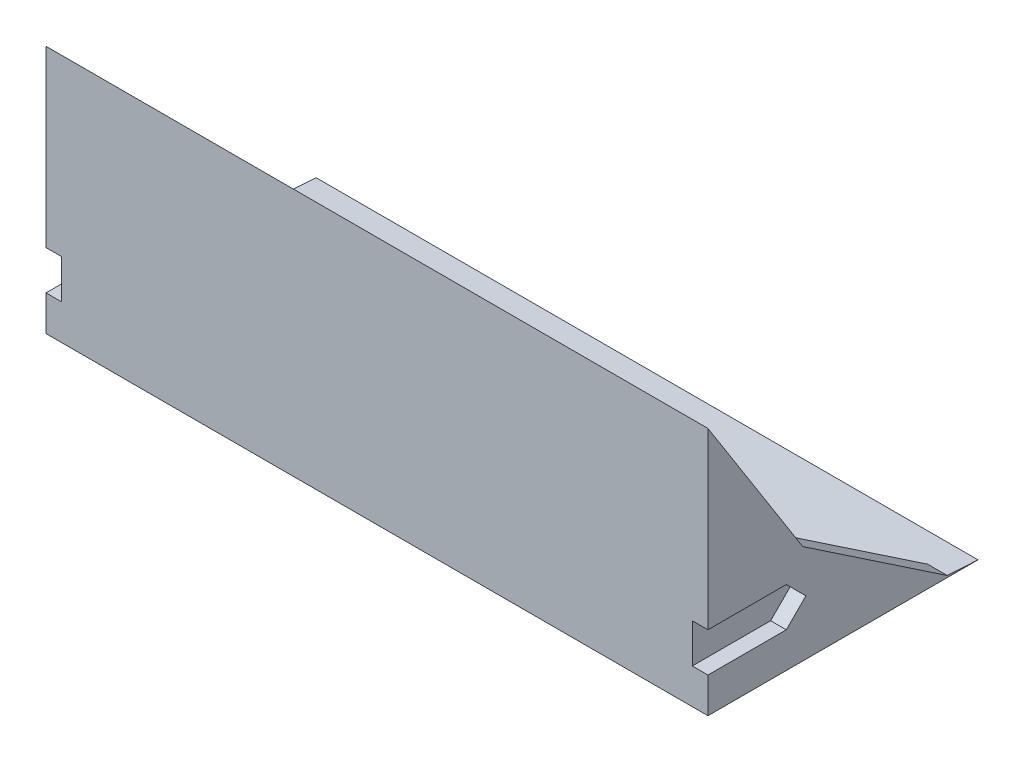
ISO-10303-21;
HEADER;
FILE_DESCRIPTION(('STEP AP214'),'2;1');
FILE_NAME('part.step','',(''),(''),'','','');
FILE_SCHEMA(('AUTOMOTIVE_DESIGN { 1 0 10303 214 1 1 1 1 }'));
ENDSEC;
DATA;
#1=APPLICATION_CONTEXT('core data for automotive mechanical design processes');
#2=APPLICATION_PROTOCOL_DEFINITION('international standard','automotive_design',2000,#1);
#3=PRODUCT_CONTEXT('',#1,'mechanical');
#4=PRODUCT('Part','Part','',(#3));
#5=PRODUCT_RELATED_PRODUCT_CATEGORY('part','',(#4));
#6=PRODUCT_DEFINITION_FORMATION('','',#4);
#7=PRODUCT_DEFINITION_CONTEXT('part definition',#1,'design');
#8=PRODUCT_DEFINITION('design','',#6,#7);
#9=PRODUCT_DEFINITION_SHAPE('','',#8);
#10=(LENGTH_UNIT() NAMED_UNIT(*) SI_UNIT(.MILLI.,.METRE.));
#11=(NAMED_UNIT(*) PLANE_ANGLE_UNIT() SI_UNIT($,.RADIAN.));
#12=(NAMED_UNIT(*) SI_UNIT($,.STERADIAN.) SOLID_ANGLE_UNIT());
#13=UNCERTAINTY_MEASURE_WITH_UNIT(LENGTH_MEASURE(1.E-05),#10,'distance_accuracy_value','');
#14=(GEOMETRIC_REPRESENTATION_CONTEXT(3) GLOBAL_UNCERTAINTY_ASSIGNED_CONTEXT((#13)) GLOBAL_UNIT_ASSIGNED_CONTEXT((#10,
#11,#12)) REPRESENTATION_CONTEXT('',''));
#15=CARTESIAN_POINT('',(0.,0.,0.));
#16=DIRECTION('',(0.,0.,1.));
#17=DIRECTION('',(1.,0.,0.));
#18=AXIS2_PLACEMENT_3D('',#15,#16,#17);
#19=CARTESIAN_POINT('',(84.455,63.5,0.));
#20=DIRECTION('',(0.,0.,-1.));
#21=DIRECTION('',(-1.,0.,0.));
#22=AXIS2_PLACEMENT_3D('',#19,#20,#21);
#23=PLANE('',#22);
#24=DIRECTION('',(-1.,0.,0.));
#25=VECTOR('',#24,1.);
#26=CARTESIAN_POINT('',(-80.455,8.99999999999999,0.));
#27=LINE('',#26,#25);
#28=CARTESIAN_POINT('',(-80.455,8.99999999999999,0.));
#29=VERTEX_POINT('',#28);
#30=CARTESIAN_POINT('',(-84.455,8.99999999999999,0.));
#31=VERTEX_POINT('',#30);
#32=EDGE_CURVE('E252',#29,#31,#27,.T.);
#33=ORIENTED_EDGE('',*,*,#32,.T.);
#34=DIRECTION('',(0.,-1.,0.));
#35=VECTOR('',#34,1.);
#36=CARTESIAN_POINT('',(-84.455,63.5,0.));
#37=LINE('',#36,#35);
#38=CARTESIAN_POINT('',(-84.455,0.,0.));
#39=VERTEX_POINT('',#38);
#40=EDGE_CURVE('E338',#31,#39,#37,.T.);
#41=ORIENTED_EDGE('',*,*,#40,.T.);
#42=DIRECTION('',(-1.,0.,0.));
#43=VECTOR('',#42,1.);
#44=CARTESIAN_POINT('',(84.455,0.,0.));
#45=LINE('',#44,#43);
#46=CARTESIAN_POINT('',(84.455,0.,0.));
#47=VERTEX_POINT('',#46);
#48=EDGE_CURVE('E363',#47,#39,#45,.T.);
#49=ORIENTED_EDGE('',*,*,#48,.F.);
#50=DIRECTION('',(0.,-1.,0.));
#51=VECTOR('',#50,1.);
#52=CARTESIAN_POINT('',(84.455,63.5,0.));
#53=LINE('',#52,#51);
#54=CARTESIAN_POINT('',(84.455,8.99999999999999,0.));
#55=VERTEX_POINT('',#54);
#56=EDGE_CURVE('E344',#55,#47,#53,.T.);
#57=ORIENTED_EDGE('',*,*,#56,.F.);
#58=DIRECTION('',(1.,0.,0.));
#59=VECTOR('',#58,1.);
#60=CARTESIAN_POINT('',(80.455,8.99999999999999,0.));
#61=LINE('',#60,#59);
#62=CARTESIAN_POINT('',(80.455,8.99999999999999,0.));
#63=VERTEX_POINT('',#62);
#64=EDGE_CURVE('E287',#63,#55,#61,.T.);
#65=ORIENTED_EDGE('',*,*,#64,.F.);
#66=DIRECTION('',(0.,-1.,0.));
#67=VECTOR('',#66,1.);
#68=CARTESIAN_POINT('',(80.455,8.99999999999999,0.));
#69=LINE('',#68,#67);
#70=CARTESIAN_POINT('',(80.455,19.,0.));
#71=VERTEX_POINT('',#70);
#72=EDGE_CURVE('E266',#71,#63,#69,.T.);
#73=ORIENTED_EDGE('',*,*,#72,.F.);
#74=DIRECTION('',(1.,0.,0.));
#75=VECTOR('',#74,1.);
#76=CARTESIAN_POINT('',(80.455,19.,0.));
#77=LINE('',#76,#75);
#78=CARTESIAN_POINT('',(84.455,19.,0.));
#79=VERTEX_POINT('',#78);
#80=EDGE_CURVE('E301',#71,#79,#77,.T.);
#81=ORIENTED_EDGE('',*,*,#80,.T.);
#82=CARTESIAN_POINT('',(84.455,63.5,0.));
#83=VERTEX_POINT('',#82);
#84=EDGE_CURVE('E339',#83,#79,#53,.T.);
#85=ORIENTED_EDGE('',*,*,#84,.F.);
#86=DIRECTION('',(-1.,0.,0.));
#87=VECTOR('',#86,1.);
#88=CARTESIAN_POINT('',(84.455,63.5,0.));
#89=LINE('',#88,#87);
#90=CARTESIAN_POINT('',(64.455,63.5,0.));
#91=VERTEX_POINT('',#90);
#92=EDGE_CURVE('E368',#83,#91,#89,.T.);
#93=ORIENTED_EDGE('',*,*,#92,.T.);
#94=CARTESIAN_POINT('',(-64.455,63.5,0.));
#95=VERTEX_POINT('',#94);
#96=EDGE_CURVE('E367',#91,#95,#89,.T.);
#97=ORIENTED_EDGE('',*,*,#96,.T.);
#98=DIRECTION('',(-1.,0.,0.));
#99=VECTOR('',#98,1.);
#100=CARTESIAN_POINT('',(-79.455,63.5,0.));
#101=LINE('',#100,#99);
#102=CARTESIAN_POINT('',(-84.455,63.5,0.));
#103=VERTEX_POINT('',#102);
#104=EDGE_CURVE('E247',#95,#103,#101,.T.);
#105=ORIENTED_EDGE('',*,*,#104,.T.);
#106=CARTESIAN_POINT('',(-84.455,19.,0.));
#107=VERTEX_POINT('',#106);
#108=EDGE_CURVE('E228',#103,#107,#37,.T.);
#109=ORIENTED_EDGE('',*,*,#108,.T.);
#110=DIRECTION('',(-1.,0.,0.));
#111=VECTOR('',#110,1.);
#112=CARTESIAN_POINT('',(-80.455,19.,0.));
#113=LINE('',#112,#111);
#114=CARTESIAN_POINT('',(-80.455,19.,0.));
#115=VERTEX_POINT('',#114);
#116=EDGE_CURVE('E207',#115,#107,#113,.T.);
#117=ORIENTED_EDGE('',*,*,#116,.F.);
#118=DIRECTION('',(0.,-1.,0.));
#119=VECTOR('',#118,1.);
#120=CARTESIAN_POINT('',(-80.455,8.99999999999999,0.));
#121=LINE('',#120,#119);
#122=EDGE_CURVE('E214',#115,#29,#121,.T.);
#123=ORIENTED_EDGE('',*,*,#122,.T.);
#124=EDGE_LOOP('',(#33,#41,#49,#57,#65,#73,#81,#85,#93,#97,#105,#109,#117,#123));
#125=FACE_BOUND('',#124,.T.);
#126=ADVANCED_FACE('F50',(#125),#23,.F.);
#127=CARTESIAN_POINT('',(-84.455,0.,0.));
#128=DIRECTION('',(-1.,0.,0.));
#129=DIRECTION('',(0.,0.,1.));
#130=AXIS2_PLACEMENT_3D('',#127,#128,#129);
#131=PLANE('',#130);
#132=ORIENTED_EDGE('',*,*,#40,.F.);
#133=DIRECTION('',(0.,0.,-1.));
#134=VECTOR('',#133,1.);
#135=CARTESIAN_POINT('',(-84.455,8.99999999999999,-20.));
#136=LINE('',#135,#134);
#137=CARTESIAN_POINT('',(-84.455,8.99999999999999,-20.));
#138=VERTEX_POINT('',#137);
#139=EDGE_CURVE('E224',#31,#138,#136,.T.);
#140=ORIENTED_EDGE('',*,*,#139,.T.);
#141=DIRECTION('',(0.,0.707106781186548,-0.707106781186548));
#142=VECTOR('',#141,1.);
#143=CARTESIAN_POINT('',(-84.455,14.,-25.));
#144=LINE('',#143,#142);
#145=CARTESIAN_POINT('',(-84.455,14.,-25.));
#146=VERTEX_POINT('',#145);
#147=EDGE_CURVE('E810',#138,#146,#144,.T.);
#148=ORIENTED_EDGE('',*,*,#147,.T.);
#149=DIRECTION('',(0.,0.707106781186548,0.707106781186548));
#150=VECTOR('',#149,1.);
#151=CARTESIAN_POINT('',(-84.455,19.,-20.));
#152=LINE('',#151,#150);
#153=CARTESIAN_POINT('',(-84.455,19.,-20.));
#154=VERTEX_POINT('',#153);
#155=EDGE_CURVE('E814',#146,#154,#152,.T.);
#156=ORIENTED_EDGE('',*,*,#155,.T.);
#157=DIRECTION('',(0.,0.,1.));
#158=VECTOR('',#157,1.);
#159=CARTESIAN_POINT('',(-84.455,19.,0.));
#160=LINE('',#159,#158);
#161=EDGE_CURVE('E818',#154,#107,#160,.T.);
#162=ORIENTED_EDGE('',*,*,#161,.T.);
#163=ORIENTED_EDGE('',*,*,#108,.F.);
#164=DIRECTION('',(0.,0.844765875126408,0.535136072622575));
#165=VECTOR('',#164,1.);
#166=CARTESIAN_POINT('',(-84.455,63.5,0.));
#167=LINE('',#166,#165);
#168=CARTESIAN_POINT('',(-84.455,25.2665789898625,-24.219826303032));
#169=VERTEX_POINT('',#168);
#170=EDGE_CURVE('E248',#169,#103,#167,.T.);
#171=ORIENTED_EDGE('',*,*,#170,.F.);
#172=DIRECTION('',(0.,0.558264030471201,0.829663348763853));
#173=VECTOR('',#172,1.);
#174=CARTESIAN_POINT('',(-84.455,25.2665789898625,-24.219826303032));
#175=LINE('',#174,#173);
#176=CARTESIAN_POINT('',(-84.455,0.484519895475625,-61.0496505712344));
#177=VERTEX_POINT('',#176);
#178=EDGE_CURVE('E244',#177,#169,#175,.T.);
#179=ORIENTED_EDGE('',*,*,#178,.F.);
#180=DIRECTION('',(0.,0.0615047512062388,0.998106790668743));
#181=VECTOR('',#180,1.);
#182=CARTESIAN_POINT('',(-84.455,0.,-68.9125));
#183=LINE('',#182,#181);
#184=CARTESIAN_POINT('',(-84.455,0.,-68.9125));
#185=VERTEX_POINT('',#184);
#186=EDGE_CURVE('E357',#185,#177,#183,.T.);
#187=ORIENTED_EDGE('',*,*,#186,.F.);
#188=DIRECTION('',(0.,0.,-1.));
#189=VECTOR('',#188,1.);
#190=CARTESIAN_POINT('',(-84.455,0.,0.));
#191=LINE('',#190,#189);
#192=EDGE_CURVE('E354',#39,#185,#191,.T.);
#193=ORIENTED_EDGE('',*,*,#192,.F.);
#194=EDGE_LOOP('',(#132,#140,#148,#156,#162,#163,#171,#179,#187,#193));
#195=FACE_BOUND('',#194,.T.);
#196=ADVANCED_FACE('F402',(#195),#131,.T.);
#197=CARTESIAN_POINT('',(84.455,4.,-4.00000000000001));
#198=DIRECTION('',(0.,-0.0670754893040511,0.997747903397758));
#199=DIRECTION('',(0.,-0.997747903397758,-0.0670754893040511));
#200=AXIS2_PLACEMENT_3D('',#197,#198,#199);
#201=PLANE('',#200);
#202=DIRECTION('',(0.,0.997747903397758,0.0670754893040511));
#203=VECTOR('',#202,1.);
#204=CARTESIAN_POINT('',(64.455,4.,-4.00000000000001));
#205=LINE('',#204,#203);
#206=CARTESIAN_POINT('',(64.455,36.6304007267167,-1.80635961501065));
#207=VERTEX_POINT('',#206);
#208=EDGE_CURVE('E475',#91,#207,#205,.F.);
#209=ORIENTED_EDGE('',*,*,#208,.T.);
#210=CARTESIAN_POINT('',(-87.4005,36.6304007267166,-1.80635961501065));
#211=CARTESIAN_POINT('',(-79.7519999999999,36.6304007267166,-1.80635961501065));
#212=CARTESIAN_POINT('',(-72.1035,36.6304007267166,-1.80635961501065));
#213=CARTESIAN_POINT('',(-21.485,36.6304007267166,-1.80635961501065));
#214=CARTESIAN_POINT('',(21.485,36.6304007267166,-1.80635961501065));
#215=CARTESIAN_POINT('',(72.1035,36.6304007267166,-1.80635961501065));
#216=CARTESIAN_POINT('',(79.752,36.6304007267166,-1.80635961501065));
#217=CARTESIAN_POINT('',(87.4005,36.6304007267166,-1.80635961501065));
#218=(BOUNDED_CURVE() B_SPLINE_CURVE(3,(#210,#211,#212,#213,#214,#215,#216,#217),.UNSPECIFIED.,
.F.,.F.) B_SPLINE_CURVE_WITH_KNOTS((4,2,2,4),(-0.1718555,-0.14891,-0.02,0.00294549999999999),
.UNSPECIFIED.) CURVE() GEOMETRIC_REPRESENTATION_ITEM() RATIONAL_B_SPLINE_CURVE((1.,1.,1.,1.,1.,
1.,1.,1.)) REPRESENTATION_ITEM(''));
#219=CARTESIAN_POINT('',(-64.455,36.6304007267167,-1.80635961501065));
#220=VERTEX_POINT('',#219);
#221=EDGE_CURVE('E472',#207,#220,#218,.F.);
#222=ORIENTED_EDGE('',*,*,#221,.T.);
#223=DIRECTION('',(0.,-0.997747903397758,-0.0670754893040511));
#224=VECTOR('',#223,1.);
#225=CARTESIAN_POINT('',(-64.455,63.5,0.));
#226=LINE('',#225,#224);
#227=EDGE_CURVE('E432',#220,#95,#226,.F.);
#228=ORIENTED_EDGE('',*,*,#227,.T.);
#229=ORIENTED_EDGE('',*,*,#96,.F.);
#230=EDGE_LOOP('',(#209,#222,#228,#229));
#231=FACE_BOUND('',#230,.T.);
#232=ADVANCED_FACE('F401',(#231),#201,.F.);
#233=CARTESIAN_POINT('',(84.455,0.,-68.9125));
#234=DIRECTION('',(0.,-0.998106790668743,0.0615047512062388));
#235=DIRECTION('',(0.,-0.0615047512062388,-0.998106790668743));
#236=AXIS2_PLACEMENT_3D('',#233,#234,#235);
#237=PLANE('',#236);
#238=DIRECTION('',(0.,-0.0615047512062388,-0.998106790668743));
#239=VECTOR('',#238,1.);
#240=CARTESIAN_POINT('',(-79.455,0.,-68.9125));
#241=LINE('',#240,#239);
#242=CARTESIAN_POINT('',(-79.455,3.03817283939165,-19.6086513907474));
#243=VERTEX_POINT('',#242);
#244=CARTESIAN_POINT('',(-79.455,0.484519895475655,-61.0496505712343));
#245=VERTEX_POINT('',#244);
#246=EDGE_CURVE('E381',#243,#245,#241,.T.);
#247=ORIENTED_EDGE('',*,*,#246,.F.);
#248=CARTESIAN_POINT('',(87.4005,3.03817283939165,-19.6086513907475));
#249=CARTESIAN_POINT('',(79.752,3.03817283939165,-19.6086513907475));
#250=CARTESIAN_POINT('',(72.1035,3.03817283939165,-19.6086513907475));
#251=CARTESIAN_POINT('',(21.485,3.03817283939165,-19.6086513907475));
#252=CARTESIAN_POINT('',(-21.485,3.03817283939165,-19.6086513907475));
#253=CARTESIAN_POINT('',(-72.1035,3.03817283939165,-19.6086513907475));
#254=CARTESIAN_POINT('',(-79.7519999999999,3.03817283939165,-19.6086513907475));
#255=CARTESIAN_POINT('',(-87.4005,3.03817283939165,-19.6086513907475));
#256=(BOUNDED_CURVE() B_SPLINE_CURVE(3,(#248,#249,#250,#251,#252,#253,#254,#255),.UNSPECIFIED.,
.F.,.F.) B_SPLINE_CURVE_WITH_KNOTS((4,2,2,4),(-0.1718555,-0.14891,-0.02,0.00294549999999999),
.UNSPECIFIED.) CURVE() GEOMETRIC_REPRESENTATION_ITEM() RATIONAL_B_SPLINE_CURVE((1.,1.,1.,1.,1.,
1.,1.,1.)) REPRESENTATION_ITEM(''));
#257=CARTESIAN_POINT('',(79.455,3.03817283939165,-19.6086513907474));
#258=VERTEX_POINT('',#257);
#259=EDGE_CURVE('E67',#243,#258,#256,.F.);
#260=ORIENTED_EDGE('',*,*,#259,.T.);
#261=DIRECTION('',(0.,0.0615047512062388,0.998106790668743));
#262=VECTOR('',#261,1.);
#263=CARTESIAN_POINT('',(79.455,0.,-68.9125));
#264=LINE('',#263,#262);
#265=CARTESIAN_POINT('',(79.455,0.484519895475655,-61.0496505712343));
#266=VERTEX_POINT('',#265);
#267=EDGE_CURVE('E377',#266,#258,#264,.T.);
#268=ORIENTED_EDGE('',*,*,#267,.F.);
#269=DIRECTION('',(1.,0.,0.));
#270=VECTOR('',#269,1.);
#271=CARTESIAN_POINT('',(84.455,0.484519895475643,-61.0496505712343));
#272=LINE('',#271,#270);
#273=CARTESIAN_POINT('',(84.455,0.484519895475616,-61.0496505712344));
#274=VERTEX_POINT('',#273);
#275=EDGE_CURVE('E334',#266,#274,#272,.T.);
#276=ORIENTED_EDGE('',*,*,#275,.T.);
#277=DIRECTION('',(0.,0.0615047512062388,0.998106790668743));
#278=VECTOR('',#277,1.);
#279=CARTESIAN_POINT('',(84.455,0.,-68.9125));
#280=LINE('',#279,#278);
#281=CARTESIAN_POINT('',(84.455,0.,-68.9125));
#282=VERTEX_POINT('',#281);
#283=EDGE_CURVE('E347',#282,#274,#280,.T.);
#284=ORIENTED_EDGE('',*,*,#283,.F.);
#285=DIRECTION('',(-1.,0.,0.));
#286=VECTOR('',#285,1.);
#287=CARTESIAN_POINT('',(84.455,0.,-68.9125));
#288=LINE('',#287,#286);
#289=EDGE_CURVE('E351',#282,#185,#288,.T.);
#290=ORIENTED_EDGE('',*,*,#289,.T.);
#291=ORIENTED_EDGE('',*,*,#186,.T.);
#292=DIRECTION('',(-1.,0.,0.));
#293=VECTOR('',#292,1.);
#294=CARTESIAN_POINT('',(84.455,0.484519895475643,-61.0496505712343));
#295=LINE('',#294,#293);
#296=EDGE_CURVE('E259',#245,#177,#295,.T.);
#297=ORIENTED_EDGE('',*,*,#296,.F.);
#298=EDGE_LOOP('',(#247,#260,#268,#276,#284,#290,#291,#297));
#299=FACE_BOUND('',#298,.T.);
#300=ADVANCED_FACE('F390',(#299),#237,.F.);
#301=CARTESIAN_POINT('',(84.455,0.,0.));
#302=DIRECTION('',(0.,1.,0.));
#303=DIRECTION('',(0.,0.,1.));
#304=AXIS2_PLACEMENT_3D('',#301,#302,#303);
#305=PLANE('',#304);
#306=ORIENTED_EDGE('',*,*,#192,.T.);
#307=ORIENTED_EDGE('',*,*,#289,.F.);
#308=DIRECTION('',(0.,0.,-1.));
#309=VECTOR('',#308,1.);
#310=CARTESIAN_POINT('',(84.455,0.,0.));
#311=LINE('',#310,#309);
#312=EDGE_CURVE('E343',#47,#282,#311,.T.);
#313=ORIENTED_EDGE('',*,*,#312,.F.);
#314=ORIENTED_EDGE('',*,*,#48,.T.);
#315=EDGE_LOOP('',(#306,#307,#313,#314));
#316=FACE_BOUND('',#315,.T.);
#317=ADVANCED_FACE('F400',(#316),#305,.F.);
#318=CARTESIAN_POINT('',(84.455,0.,0.));
#319=DIRECTION('',(-1.,0.,0.));
#320=DIRECTION('',(0.,0.,1.));
#321=AXIS2_PLACEMENT_3D('',#318,#319,#320);
#322=PLANE('',#321);
#323=ORIENTED_EDGE('',*,*,#84,.T.);
#324=DIRECTION('',(0.,0.,1.));
#325=VECTOR('',#324,1.);
#326=CARTESIAN_POINT('',(84.455,19.,0.));
#327=LINE('',#326,#325);
#328=CARTESIAN_POINT('',(84.455,19.,-20.));
#329=VERTEX_POINT('',#328);
#330=EDGE_CURVE('E271',#329,#79,#327,.T.);
#331=ORIENTED_EDGE('',*,*,#330,.F.);
#332=DIRECTION('',(0.,0.707106781186548,0.707106781186548));
#333=VECTOR('',#332,1.);
#334=CARTESIAN_POINT('',(84.455,19.,-20.));
#335=LINE('',#334,#333);
#336=CARTESIAN_POINT('',(84.455,14.,-25.));
#337=VERTEX_POINT('',#336);
#338=EDGE_CURVE('E295',#337,#329,#335,.T.);
#339=ORIENTED_EDGE('',*,*,#338,.F.);
#340=DIRECTION('',(0.,0.707106781186548,-0.707106781186548));
#341=VECTOR('',#340,1.);
#342=CARTESIAN_POINT('',(84.455,14.,-25.));
#343=LINE('',#342,#341);
#344=CARTESIAN_POINT('',(84.455,8.99999999999999,-20.));
#345=VERTEX_POINT('',#344);
#346=EDGE_CURVE('E291',#345,#337,#343,.T.);
#347=ORIENTED_EDGE('',*,*,#346,.F.);
#348=DIRECTION('',(0.,0.,-1.));
#349=VECTOR('',#348,1.);
#350=CARTESIAN_POINT('',(84.455,8.99999999999999,-20.));
#351=LINE('',#350,#349);
#352=EDGE_CURVE('E265',#55,#345,#351,.T.);
#353=ORIENTED_EDGE('',*,*,#352,.F.);
#354=ORIENTED_EDGE('',*,*,#56,.T.);
#355=ORIENTED_EDGE('',*,*,#312,.T.);
#356=ORIENTED_EDGE('',*,*,#283,.T.);
#357=DIRECTION('',(0.,0.558264030471201,0.829663348763853));
#358=VECTOR('',#357,1.);
#359=CARTESIAN_POINT('',(84.455,25.2665789898625,-24.219826303032));
#360=LINE('',#359,#358);
#361=CARTESIAN_POINT('',(84.455,25.2665789898625,-24.219826303032));
#362=VERTEX_POINT('',#361);
#363=EDGE_CURVE('E305',#274,#362,#360,.T.);
#364=ORIENTED_EDGE('',*,*,#363,.T.);
#365=DIRECTION('',(0.,0.844765875126408,0.535136072622575));
#366=VECTOR('',#365,1.);
#367=CARTESIAN_POINT('',(84.455,63.5,0.));
#368=LINE('',#367,#366);
#369=EDGE_CURVE('E321',#362,#83,#368,.T.);
#370=ORIENTED_EDGE('',*,*,#369,.T.);
#371=EDGE_LOOP('',(#323,#331,#339,#347,#353,#354,#355,#356,#364,#370));
#372=FACE_BOUND('',#371,.T.);
#373=ADVANCED_FACE('F406',(#372),#322,.F.);
#374=CARTESIAN_POINT('',(79.455,0.,0.));
#375=DIRECTION('',(1.,0.,0.));
#376=DIRECTION('',(0.,0.,-1.));
#377=AXIS2_PLACEMENT_3D('',#374,#375,#376);
#378=PLANE('',#377);
#379=ORIENTED_EDGE('',*,*,#267,.T.);
#380=CARTESIAN_POINT('',(79.455,36.6304007267166,-1.80635961501065));
#381=CARTESIAN_POINT('',(79.455,4.00000000000001,-4.00000000000001));
#382=CARTESIAN_POINT('',(79.455,3.03817283939165,-19.6086513907475));
#383=(BOUNDED_CURVE() B_SPLINE_CURVE(2,(#380,#381,#382),.UNSPECIFIED.,.F.,
.F.) B_SPLINE_CURVE_WITH_KNOTS((3,3),(0.,1.),
.UNSPECIFIED.) CURVE() GEOMETRIC_REPRESENTATION_ITEM() RATIONAL_B_SPLINE_CURVE((1.,
0.751104099951141,1.)) REPRESENTATION_ITEM(''));
#384=CARTESIAN_POINT('',(79.455,3.08537453758806,-19.0953451258889));
#385=VERTEX_POINT('',#384);
#386=EDGE_CURVE('E371',#258,#385,#383,.F.);
#387=ORIENTED_EDGE('',*,*,#386,.T.);
#388=DIRECTION('',(0.,0.997747903397758,0.0670754893040511));
#389=VECTOR('',#388,1.);
#390=CARTESIAN_POINT('',(79.455,64.5061323395608,-14.9662185509664));
#391=LINE('',#390,#389);
#392=CARTESIAN_POINT('',(79.455,36.9499418156195,-16.8187355609792));
#393=VERTEX_POINT('',#392);
#394=EDGE_CURVE('E380',#385,#393,#391,.T.);
#395=ORIENTED_EDGE('',*,*,#394,.T.);
#396=DIRECTION('',(0.,0.844765875126408,0.535136072622575));
#397=VECTOR('',#396,1.);
#398=CARTESIAN_POINT('',(79.455,63.5,0.));
#399=LINE('',#398,#397);
#400=CARTESIAN_POINT('',(79.455,25.2665789898625,-24.219826303032));
#401=VERTEX_POINT('',#400);
#402=EDGE_CURVE('E320',#401,#393,#399,.T.);
#403=ORIENTED_EDGE('',*,*,#402,.F.);
#404=DIRECTION('',(0.,0.558264030471201,0.829663348763853));
#405=VECTOR('',#404,1.);
#406=CARTESIAN_POINT('',(79.455,25.2665789898625,-24.219826303032));
#407=LINE('',#406,#405);
#408=EDGE_CURVE('E317',#266,#401,#407,.T.);
#409=ORIENTED_EDGE('',*,*,#408,.F.);
#410=EDGE_LOOP('',(#379,#387,#395,#403,#409));
#411=FACE_BOUND('',#410,.T.);
#412=ADVANCED_FACE('F492',(#411),#378,.F.);
#413=CARTESIAN_POINT('',(79.455,25.2665789898625,-24.219826303032));
#414=DIRECTION('',(0.,0.829663348763853,-0.558264030471201));
#415=DIRECTION('',(0.,0.558264030471201,0.829663348763853));
#416=AXIS2_PLACEMENT_3D('',#413,#414,#415);
#417=PLANE('',#416);
#418=ORIENTED_EDGE('',*,*,#275,.F.);
#419=ORIENTED_EDGE('',*,*,#408,.T.);
#420=DIRECTION('',(1.,0.,0.));
#421=VECTOR('',#420,1.);
#422=CARTESIAN_POINT('',(79.455,25.2665789898625,-24.219826303032));
#423=LINE('',#422,#421);
#424=EDGE_CURVE('E325',#401,#362,#423,.T.);
#425=ORIENTED_EDGE('',*,*,#424,.T.);
#426=ORIENTED_EDGE('',*,*,#363,.F.);
#427=EDGE_LOOP('',(#418,#419,#425,#426));
#428=FACE_BOUND('',#427,.T.);
#429=ADVANCED_FACE('F501',(#428),#417,.T.);
#430=CARTESIAN_POINT('',(79.455,63.5,0.));
#431=DIRECTION('',(0.,0.535136072622575,-0.844765875126408));
#432=DIRECTION('',(0.,0.844765875126408,0.535136072622575));
#433=AXIS2_PLACEMENT_3D('',#430,#431,#432);
#434=PLANE('',#433);
#435=ORIENTED_EDGE('',*,*,#369,.F.);
#436=ORIENTED_EDGE('',*,*,#424,.F.);
#437=ORIENTED_EDGE('',*,*,#402,.T.);
#438=CARTESIAN_POINT('',(64.455,36.9499418156194,-16.8187355609792));
#439=DIRECTION('',(0.,0.535136072622575,-0.844765875126408));
#440=DIRECTION('',(0.,-0.844765875126408,-0.535136072622575));
#441=AXIS2_PLACEMENT_3D('',#438,#439,#440);
#442=ELLIPSE('',#441,31.4288952313654,15.);
#443=EDGE_CURVE('E477',#393,#91,#442,.F.);
#444=ORIENTED_EDGE('',*,*,#443,.T.);
#445=ORIENTED_EDGE('',*,*,#92,.F.);
#446=EDGE_LOOP('',(#435,#436,#437,#444,#445));
#447=FACE_BOUND('',#446,.T.);
#448=ADVANCED_FACE('F499',(#447),#434,.T.);
#449=CARTESIAN_POINT('',(64.455,1.29182653991226,-19.2159197811949));
#450=DIRECTION('',(0.,-0.997747903397758,-0.0670754893040511));
#451=DIRECTION('',(0.,0.0670754893040511,-0.997747903397758));
#452=AXIS2_PLACEMENT_3D('',#449,#450,#451);
#453=CYLINDRICAL_SURFACE('',#452,15.);
#454=ORIENTED_EDGE('',*,*,#394,.F.);
#455=CARTESIAN_POINT('',(64.455,36.6304007267166,-1.80635961501065));
#456=CARTESIAN_POINT('',(64.6228030563619,36.2501612579925,-1.8319289750874));
#457=CARTESIAN_POINT('',(64.7910995084758,35.8703236044481,-1.86026474279662));
#458=CARTESIAN_POINT('',(65.188232591803,34.9758586484165,-1.93364661696722));
#459=CARTESIAN_POINT('',(65.4172421139485,34.4615001805187,-1.98104749565103));
#460=CARTESIAN_POINT('',(65.9357419610446,33.2960773376709,-2.10040508787609));
#461=CARTESIAN_POINT('',(66.2250257681171,32.6452453878374,-2.17553868307378));
#462=CARTESIAN_POINT('',(66.8642605223384,31.2072403379949,-2.36080404079378));
#463=CARTESIAN_POINT('',(67.2140323051674,30.420501800424,-2.47498055291457));
#464=CARTESIAN_POINT('',(67.7612934810622,29.1922742393193,-2.67412021195522));
#465=CARTESIAN_POINT('',(67.9588847006252,28.7493728635961,-2.75020667656666));
#466=CARTESIAN_POINT('',(68.3693417284767,27.8319405920941,-2.91693497479399));
#467=CARTESIAN_POINT('',(68.5822359964741,27.3575425695127,-3.00824169968019));
#468=CARTESIAN_POINT('',(68.9764889377832,26.4807231101201,-3.18675341319299));
#469=CARTESIAN_POINT('',(69.1578591287313,26.0780240784509,-3.27257093108459));
#470=CARTESIAN_POINT('',(69.5118041967012,25.2921317222223,-3.44780153730745));
#471=CARTESIAN_POINT('',(69.6844075469912,24.9088761980314,-3.53687898251952));
#472=CARTESIAN_POINT('',(70.176811242869,23.816735989914,-3.80143272197914));
#473=CARTESIAN_POINT('',(70.4962196945943,23.1097592035896,-3.98563190923262));
#474=CARTESIAN_POINT('',(71.1004987317509,21.7766316867741,-4.35939409185443));
#475=CARTESIAN_POINT('',(71.3854702054504,21.1497971829356,-4.54635753235064));
#476=CARTESIAN_POINT('',(71.9209682598358,19.9758446268205,-4.91935233356054));
#477=CARTESIAN_POINT('',(72.1716140654077,19.4280009564525,-5.10292033651344));
#478=CARTESIAN_POINT('',(72.6381244577087,18.4092554173108,-5.46353185178124));
#479=CARTESIAN_POINT('',(72.8542503846564,17.9376620639047,-5.63828839186629));
#480=CARTESIAN_POINT('',(73.3994205668233,16.7462114733178,-6.10131514098746));
#481=CARTESIAN_POINT('',(73.726567181488,16.0294860302276,-6.40001654398896));
#482=CARTESIAN_POINT('',(74.3503658460542,14.6644447501999,-7.01359659190567));
#483=CARTESIAN_POINT('',(74.647463317326,14.0150328701408,-7.32557692349758));
#484=CARTESIAN_POINT('',(75.2108501534941,12.7852702952496,-7.96123123086836));
#485=CARTESIAN_POINT('',(75.4776740364743,12.2036108246562,-8.28186948246874));
#486=CARTESIAN_POINT('',(75.8633038017501,11.3638084011207,-8.77940242113284));
#487=CARTESIAN_POINT('',(75.9852040201397,11.0984688285344,-8.94182621658661));
#488=CARTESIAN_POINT('',(76.2213212652217,10.584501247193,-9.26760224234249));
#489=CARTESIAN_POINT('',(76.3356324971018,10.3356687573208,-9.43056236947155));
#490=CARTESIAN_POINT('',(76.556576758536,9.85441954747477,-9.75690863727728));
#491=CARTESIAN_POINT('',(76.6633158057232,9.62178628222888,-9.91990297640004));
#492=CARTESIAN_POINT('',(76.8690469061575,9.17255704996344,-10.2458639882113));
#493=CARTESIAN_POINT('',(76.9681621682067,8.95573409041055,-10.4084400012615));
#494=CARTESIAN_POINT('',(77.2016614568769,8.44378609407945,-10.8060623208389));
#495=CARTESIAN_POINT('',(77.3348127011193,8.15091229383325,-11.0447576013235));
#496=CARTESIAN_POINT('',(77.5884760458275,7.5915891498265,-11.5257472608804));
#497=CARTESIAN_POINT('',(77.7092852044435,7.32455811839468,-11.7672058837819));
#498=CARTESIAN_POINT('',(77.9381617694918,6.81691119609217,-12.2528461152427));
#499=CARTESIAN_POINT('',(78.0465650559025,6.57564660253349,-12.4961883380084));
#500=CARTESIAN_POINT('',(78.250620247609,6.11935461507841,-12.9847456601035));
#501=CARTESIAN_POINT('',(78.3466452258405,5.9036139203013,-13.229132588197));
#502=CARTESIAN_POINT('',(78.4829409825227,5.59522951454253,-13.6015756522424));
#503=CARTESIAN_POINT('',(78.526204187679,5.49699109587515,-13.7239334881754));
#504=CARTESIAN_POINT('',(78.6095741929581,5.30685064419476,-13.968688995673));
#505=CARTESIAN_POINT('',(78.6497354083455,5.21484826353374,-14.0909900507745));
#506=CARTESIAN_POINT('',(78.739165116759,5.00884057013578,-14.3744313376935));
#507=CARTESIAN_POINT('',(78.7877566815795,4.89606029852569,-14.5366835041195));
#508=CARTESIAN_POINT('',(78.8572396763998,4.73336464202999,-14.782480409251));
#509=CARTESIAN_POINT('',(78.879593455037,4.68078448044606,-14.8638607648448));
#510=CARTESIAN_POINT('',(78.9230099950213,4.57815871405844,-15.0267743270954));
#511=CARTESIAN_POINT('',(78.9440869931386,4.52808707445844,-15.1082873395246));
#512=CARTESIAN_POINT('',(79.0049363399329,4.38273693020132,-15.351239687691));
#513=CARTESIAN_POINT('',(79.0433138519666,4.29001361250386,-15.5145748700255));
#514=CARTESIAN_POINT('',(79.114843226104,4.11479872831066,-15.8416136001019));
#515=CARTESIAN_POINT('',(79.1481121786805,4.03209196115485,-16.0051760960297));
#516=CARTESIAN_POINT('',(79.2094244167134,3.87686482826135,-16.3324542559202));
#517=CARTESIAN_POINT('',(79.23758494798,3.80412904626845,-16.4960454802604));
#518=CARTESIAN_POINT('',(79.2886817643049,3.66877148242912,-16.8231767254675));
#519=CARTESIAN_POINT('',(79.3117334626764,3.60593823426571,-16.9866105642568));
#520=CARTESIAN_POINT('',(79.3425727152577,3.51869792688378,-17.232977926871));
#521=CARTESIAN_POINT('',(79.3521571236033,3.49101189114184,-17.3145399682417));
#522=CARTESIAN_POINT('',(79.3700355401338,3.43810290275744,-17.4775579325873));
#523=CARTESIAN_POINT('',(79.3783430847427,3.41285534698317,-17.559004348187));
#524=CARTESIAN_POINT('',(79.3936677302527,3.36480908964669,-17.7217634012241));
#525=CARTESIAN_POINT('',(79.4006979172239,3.3419866828235,-17.8030678094565));
#526=CARTESIAN_POINT('',(79.4134684505272,3.29877338390641,-17.9655191893142));
#527=CARTESIAN_POINT('',(79.4192213458183,3.27835985228205,-18.0466591444445));
#528=CARTESIAN_POINT('',(79.4294378168476,3.23994603718758,-18.2087574550857));
#529=CARTESIAN_POINT('',(79.4339133268478,3.2219243187637,-18.2897099740683));
#530=CARTESIAN_POINT('',(79.4415757249491,3.18827425604515,-18.4514098631817));
#531=CARTESIAN_POINT('',(79.4447738550701,3.1726258192584,-18.5321525153036));
#532=CARTESIAN_POINT('',(79.4498820443084,3.14370166448132,-18.6934098940333));
#533=CARTESIAN_POINT('',(79.4518025827422,3.13040731615291,-18.7739209422692));
#534=CARTESIAN_POINT('',(79.4543569990986,3.10616758412779,-18.934691591724));
#535=CARTESIAN_POINT('',(79.4550005208058,3.09520515699827,-19.0149484720768));
#536=CARTESIAN_POINT('',(79.4550000000001,3.08537453758806,-19.0953451258889));
#537=B_SPLINE_CURVE_WITH_KNOTS('',3,(#455,#456,#457,#458,#459,#460,#461,#462,#463,#464,#465,
#466,#467,#468,#469,#470,#471,#472,#473,#474,#475,#476,#477,#478,#479,#480,#481,#482,#483,#484,
#485,#486,#487,#488,#489,#490,#491,#492,#493,#494,#495,#496,#497,#498,#499,#500,#501,#502,#503,
#504,#505,#506,#507,#508,#509,#510,#511,#512,#513,#514,#515,#516,#517,#518,#519,#520,#521,#522,
#523,#524,#525,#526,#527,#528,#529,#530,#531,#532,#533,#534,#535,#536),.UNSPECIFIED.,.F.,.F.,(4,
2,2,2,2,2,2,2,2,2,2,2,2,2,2,2,2,2,2,2,2,2,2,2,2,2,2,2,2,2,2,2,2,2,2,2,2,2,2,2,4),(0.,
1.24921242742845,2.94419956187656,5.09254301910018,7.6976838731396,9.17035246548249,
10.7540507956151,12.1037389567603,13.3926837610207,15.7842681126716,17.924434425733,
19.8135489347436,21.4555774305377,23.9822693368748,26.3192595217383,28.4653952191831,
29.4676794785921,30.4234996166012,31.3336853135966,32.1992339188948,33.4005292128622,
34.5392232565399,35.6168939361218,36.6357059903414,37.1239379389665,37.5985297097028,
38.2087376749745,38.5070143183566,38.8008640857238,39.3756963019497,39.9342719186692,
40.4776998060922,41.0071975599168,41.2671591291445,41.5241397969013,41.7783176950852,
42.0298754667876,42.2789997162771,42.5258804164957,42.7707102783892,43.0136840875069),.UNSPECIFIED.);
#538=EDGE_CURVE('E12',#385,#207,#537,.F.);
#539=ORIENTED_EDGE('',*,*,#538,.T.);
#540=ORIENTED_EDGE('',*,*,#208,.F.);
#541=ORIENTED_EDGE('',*,*,#443,.F.);
#542=EDGE_LOOP('',(#454,#539,#540,#541));
#543=FACE_BOUND('',#542,.T.);
#544=ADVANCED_FACE('F414',(#543),#453,.F.);
#545=CARTESIAN_POINT('',(80.455,19.,0.));
#546=DIRECTION('',(0.,1.,0.));
#547=DIRECTION('',(0.,0.,1.));
#548=AXIS2_PLACEMENT_3D('',#545,#546,#547);
#549=PLANE('',#548);
#550=ORIENTED_EDGE('',*,*,#330,.T.);
#551=ORIENTED_EDGE('',*,*,#80,.F.);
#552=DIRECTION('',(0.,0.,1.));
#553=VECTOR('',#552,1.);
#554=CARTESIAN_POINT('',(80.455,19.,0.));
#555=LINE('',#554,#553);
#556=CARTESIAN_POINT('',(80.455,19.,-20.));
#557=VERTEX_POINT('',#556);
#558=EDGE_CURVE('E283',#557,#71,#555,.T.);
#559=ORIENTED_EDGE('',*,*,#558,.F.);
#560=DIRECTION('',(1.,0.,0.));
#561=VECTOR('',#560,1.);
#562=CARTESIAN_POINT('',(80.455,19.,-20.));
#563=LINE('',#562,#561);
#564=EDGE_CURVE('E306',#557,#329,#563,.T.);
#565=ORIENTED_EDGE('',*,*,#564,.T.);
#566=EDGE_LOOP('',(#550,#551,#559,#565));
#567=FACE_BOUND('',#566,.T.);
#568=ADVANCED_FACE('F594',(#567),#549,.F.);
#569=CARTESIAN_POINT('',(80.455,19.,-20.));
#570=DIRECTION('',(0.,0.707106781186547,-0.707106781186547));
#571=DIRECTION('',(0.,0.707106781186548,0.707106781186548));
#572=AXIS2_PLACEMENT_3D('',#569,#570,#571);
#573=PLANE('',#572);
#574=ORIENTED_EDGE('',*,*,#338,.T.);
#575=ORIENTED_EDGE('',*,*,#564,.F.);
#576=DIRECTION('',(0.,0.707106781186548,0.707106781186548));
#577=VECTOR('',#576,1.);
#578=CARTESIAN_POINT('',(80.455,19.,-20.));
#579=LINE('',#578,#577);
#580=CARTESIAN_POINT('',(80.455,14.,-25.));
#581=VERTEX_POINT('',#580);
#582=EDGE_CURVE('E279',#581,#557,#579,.T.);
#583=ORIENTED_EDGE('',*,*,#582,.F.);
#584=DIRECTION('',(1.,0.,0.));
#585=VECTOR('',#584,1.);
#586=CARTESIAN_POINT('',(80.455,14.,-25.));
#587=LINE('',#586,#585);
#588=EDGE_CURVE('E309',#581,#337,#587,.T.);
#589=ORIENTED_EDGE('',*,*,#588,.T.);
#590=EDGE_LOOP('',(#574,#575,#583,#589));
#591=FACE_BOUND('',#590,.T.);
#592=ADVANCED_FACE('F599',(#591),#573,.F.);
#593=CARTESIAN_POINT('',(80.455,14.,-25.));
#594=DIRECTION('',(0.,-0.707106781186547,-0.707106781186547));
#595=DIRECTION('',(0.,0.707106781186548,-0.707106781186548));
#596=AXIS2_PLACEMENT_3D('',#593,#594,#595);
#597=PLANE('',#596);
#598=ORIENTED_EDGE('',*,*,#346,.T.);
#599=ORIENTED_EDGE('',*,*,#588,.F.);
#600=DIRECTION('',(0.,0.707106781186548,-0.707106781186548));
#601=VECTOR('',#600,1.);
#602=CARTESIAN_POINT('',(80.455,14.,-25.));
#603=LINE('',#602,#601);
#604=CARTESIAN_POINT('',(80.455,8.99999999999999,-20.));
#605=VERTEX_POINT('',#604);
#606=EDGE_CURVE('E275',#605,#581,#603,.T.);
#607=ORIENTED_EDGE('',*,*,#606,.F.);
#608=DIRECTION('',(1.,0.,0.));
#609=VECTOR('',#608,1.);
#610=CARTESIAN_POINT('',(80.455,8.99999999999999,-20.));
#611=LINE('',#610,#609);
#612=EDGE_CURVE('E312',#605,#345,#611,.T.);
#613=ORIENTED_EDGE('',*,*,#612,.T.);
#614=EDGE_LOOP('',(#598,#599,#607,#613));
#615=FACE_BOUND('',#614,.T.);
#616=ADVANCED_FACE('F708',(#615),#597,.F.);
#617=CARTESIAN_POINT('',(80.455,8.99999999999999,-20.));
#618=DIRECTION('',(0.,-1.,0.));
#619=DIRECTION('',(0.,0.,-1.));
#620=AXIS2_PLACEMENT_3D('',#617,#618,#619);
#621=PLANE('',#620);
#622=ORIENTED_EDGE('',*,*,#352,.T.);
#623=ORIENTED_EDGE('',*,*,#612,.F.);
#624=DIRECTION('',(0.,0.,-1.));
#625=VECTOR('',#624,1.);
#626=CARTESIAN_POINT('',(80.455,8.99999999999999,-20.));
#627=LINE('',#626,#625);
#628=EDGE_CURVE('E270',#63,#605,#627,.T.);
#629=ORIENTED_EDGE('',*,*,#628,.F.);
#630=ORIENTED_EDGE('',*,*,#64,.T.);
#631=EDGE_LOOP('',(#622,#623,#629,#630));
#632=FACE_BOUND('',#631,.T.);
#633=ADVANCED_FACE('F700',(#632),#621,.F.);
#634=CARTESIAN_POINT('',(80.455,0.,0.));
#635=DIRECTION('',(-1.,0.,0.));
#636=DIRECTION('',(0.,0.,1.));
#637=AXIS2_PLACEMENT_3D('',#634,#635,#636);
#638=PLANE('',#637);
#639=ORIENTED_EDGE('',*,*,#72,.T.);
#640=ORIENTED_EDGE('',*,*,#628,.T.);
#641=ORIENTED_EDGE('',*,*,#606,.T.);
#642=ORIENTED_EDGE('',*,*,#582,.T.);
#643=ORIENTED_EDGE('',*,*,#558,.T.);
#644=EDGE_LOOP('',(#639,#640,#641,#642,#643));
#645=FACE_BOUND('',#644,.T.);
#646=ADVANCED_FACE('F696',(#645),#638,.F.);
#647=CARTESIAN_POINT('',(-79.455,0.,0.));
#648=DIRECTION('',(-1.,0.,0.));
#649=DIRECTION('',(0.,0.,-1.));
#650=AXIS2_PLACEMENT_3D('',#647,#648,#649);
#651=PLANE('',#650);
#652=DIRECTION('',(0.,0.844765875126408,0.535136072622575));
#653=VECTOR('',#652,1.);
#654=CARTESIAN_POINT('',(-79.455,63.5,0.));
#655=LINE('',#654,#653);
#656=CARTESIAN_POINT('',(-79.455,25.2665789898625,-24.219826303032));
#657=VERTEX_POINT('',#656);
#658=CARTESIAN_POINT('',(-79.455,36.9499418156194,-16.8187355609792));
#659=VERTEX_POINT('',#658);
#660=EDGE_CURVE('E239',#657,#659,#655,.T.);
#661=ORIENTED_EDGE('',*,*,#660,.T.);
#662=DIRECTION('',(0.,-0.997747903397758,-0.0670754893040511));
#663=VECTOR('',#662,1.);
#664=CARTESIAN_POINT('',(-79.455,5.00613233956077,-18.9662185509664));
#665=LINE('',#664,#663);
#666=CARTESIAN_POINT('',(-79.455,3.08537453758806,-19.0953451258889));
#667=VERTEX_POINT('',#666);
#668=EDGE_CURVE('E423',#659,#667,#665,.T.);
#669=ORIENTED_EDGE('',*,*,#668,.T.);
#670=CARTESIAN_POINT('',(-79.455,3.03817283939165,-19.6086513907475));
#671=CARTESIAN_POINT('',(-79.455,4.00000000000001,-4.00000000000001));
#672=CARTESIAN_POINT('',(-79.455,36.6304007267166,-1.80635961501065));
#673=(BOUNDED_CURVE() B_SPLINE_CURVE(2,(#670,#671,#672),.UNSPECIFIED.,.F.,
.F.) B_SPLINE_CURVE_WITH_KNOTS((3,3),(0.,1.),
.UNSPECIFIED.) CURVE() GEOMETRIC_REPRESENTATION_ITEM() RATIONAL_B_SPLINE_CURVE((1.,
0.751104099951141,1.)) REPRESENTATION_ITEM(''));
#674=EDGE_CURVE('E433',#667,#243,#673,.F.);
#675=ORIENTED_EDGE('',*,*,#674,.T.);
#676=ORIENTED_EDGE('',*,*,#246,.T.);
#677=DIRECTION('',(0.,0.558264030471201,0.829663348763853));
#678=VECTOR('',#677,1.);
#679=CARTESIAN_POINT('',(-79.455,25.2665789898625,-24.219826303032));
#680=LINE('',#679,#678);
#681=EDGE_CURVE('E243',#245,#657,#680,.T.);
#682=ORIENTED_EDGE('',*,*,#681,.T.);
#683=EDGE_LOOP('',(#661,#669,#675,#676,#682));
#684=FACE_BOUND('',#683,.T.);
#685=ADVANCED_FACE('F521',(#684),#651,.F.);
#686=CARTESIAN_POINT('',(-79.455,25.2665789898625,-24.219826303032));
#687=DIRECTION('',(0.,-0.829663348763853,0.558264030471201));
#688=DIRECTION('',(0.,-0.558264030471201,-0.829663348763853));
#689=AXIS2_PLACEMENT_3D('',#686,#687,#688);
#690=PLANE('',#689);
#691=ORIENTED_EDGE('',*,*,#681,.F.);
#692=ORIENTED_EDGE('',*,*,#296,.T.);
#693=ORIENTED_EDGE('',*,*,#178,.T.);
#694=DIRECTION('',(-1.,0.,0.));
#695=VECTOR('',#694,1.);
#696=CARTESIAN_POINT('',(-79.455,25.2665789898625,-24.219826303032));
#697=LINE('',#696,#695);
#698=EDGE_CURVE('E255',#657,#169,#697,.T.);
#699=ORIENTED_EDGE('',*,*,#698,.F.);
#700=EDGE_LOOP('',(#691,#692,#693,#699));
#701=FACE_BOUND('',#700,.T.);
#702=ADVANCED_FACE('F462',(#701),#690,.F.);
#703=CARTESIAN_POINT('',(-79.455,63.5,0.));
#704=DIRECTION('',(0.,-0.535136072622575,0.844765875126408));
#705=DIRECTION('',(0.,-0.844765875126408,-0.535136072622575));
#706=AXIS2_PLACEMENT_3D('',#703,#704,#705);
#707=PLANE('',#706);
#708=ORIENTED_EDGE('',*,*,#170,.T.);
#709=ORIENTED_EDGE('',*,*,#104,.F.);
#710=CARTESIAN_POINT('',(-64.455,36.9499418156194,-16.8187355609792));
#711=DIRECTION('',(0.,-0.535136072622575,0.844765875126408));
#712=DIRECTION('',(0.,0.844765875126408,0.535136072622575));
#713=AXIS2_PLACEMENT_3D('',#710,#711,#712);
#714=ELLIPSE('',#713,31.4288952313654,15.);
#715=EDGE_CURVE('E466',#95,#659,#714,.T.);
#716=ORIENTED_EDGE('',*,*,#715,.T.);
#717=ORIENTED_EDGE('',*,*,#660,.F.);
#718=ORIENTED_EDGE('',*,*,#698,.T.);
#719=EDGE_LOOP('',(#708,#709,#716,#717,#718));
#720=FACE_BOUND('',#719,.T.);
#721=ADVANCED_FACE('F452',(#720),#707,.F.);
#722=CARTESIAN_POINT('',(-64.455,1.29182653991226,-19.2159197811949));
#723=DIRECTION('',(0.,0.997747903397758,0.0670754893040511));
#724=DIRECTION('',(0.,-0.0670754893040511,0.997747903397758));
#725=AXIS2_PLACEMENT_3D('',#722,#723,#724);
#726=CYLINDRICAL_SURFACE('',#725,15.);
#727=ORIENTED_EDGE('',*,*,#227,.F.);
#728=CARTESIAN_POINT('',(-79.4550000000001,3.08537453758806,-19.0953451258889));
#729=CARTESIAN_POINT('',(-79.4550005208058,3.09520515699827,-19.0149484720768));
#730=CARTESIAN_POINT('',(-79.4543569990986,3.10616758412779,-18.934691591724));
#731=CARTESIAN_POINT('',(-79.4518025827422,3.13040731615291,-18.7739209422692));
#732=CARTESIAN_POINT('',(-79.4498820443083,3.14370166448132,-18.6934098940333));
#733=CARTESIAN_POINT('',(-79.4447738550701,3.1726258192584,-18.5321525153036));
#734=CARTESIAN_POINT('',(-79.441575724949,3.18827425604515,-18.4514098631817));
#735=CARTESIAN_POINT('',(-79.4339133268478,3.2219243187637,-18.2897099740683));
#736=CARTESIAN_POINT('',(-79.4294378168477,3.23994603718758,-18.2087574550858));
#737=CARTESIAN_POINT('',(-79.4192213458183,3.27835985228204,-18.0466591444445));
#738=CARTESIAN_POINT('',(-79.4134684505271,3.2987733839064,-17.9655191893142));
#739=CARTESIAN_POINT('',(-79.4006979172239,3.3419866828235,-17.8030678094565));
#740=CARTESIAN_POINT('',(-79.3936677302526,3.36480908964669,-17.7217634012241));
#741=CARTESIAN_POINT('',(-79.3783430847427,3.41285534698316,-17.5590043481871));
#742=CARTESIAN_POINT('',(-79.3700355401337,3.43810290275743,-17.4775579325874));
#743=CARTESIAN_POINT('',(-79.3521571236033,3.49101189114183,-17.3145399682418));
#744=CARTESIAN_POINT('',(-79.3425727152576,3.51869792688377,-17.2329779268711));
#745=CARTESIAN_POINT('',(-79.3117334626764,3.6059382342657,-16.9866105642568));
#746=CARTESIAN_POINT('',(-79.2886817643049,3.66877148242911,-16.8231767254676));
#747=CARTESIAN_POINT('',(-79.23758494798,3.80412904626844,-16.4960454802604));
#748=CARTESIAN_POINT('',(-79.2094244167133,3.87686482826134,-16.3324542559202));
#749=CARTESIAN_POINT('',(-79.1481121786805,4.03209196115484,-16.0051760960297));
#750=CARTESIAN_POINT('',(-79.114843226104,4.11479872831065,-15.8416136001019));
#751=CARTESIAN_POINT('',(-79.0433138519666,4.29001361250385,-15.5145748700255));
#752=CARTESIAN_POINT('',(-79.0049363399329,4.38273693020132,-15.351239687691));
#753=CARTESIAN_POINT('',(-78.9440869931386,4.52808707445844,-15.1082873395247));
#754=CARTESIAN_POINT('',(-78.9230099950212,4.57815871405844,-15.0267743270955));
#755=CARTESIAN_POINT('',(-78.8795934550369,4.68078448044606,-14.8638607648448));
#756=CARTESIAN_POINT('',(-78.8572396763998,4.73336464202999,-14.782480409251));
#757=CARTESIAN_POINT('',(-78.7877566815795,4.8960602985257,-14.5366835041195));
#758=CARTESIAN_POINT('',(-78.739165116759,5.00884057013579,-14.3744313376935));
#759=CARTESIAN_POINT('',(-78.6497354083455,5.21484826353376,-14.0909900507745));
#760=CARTESIAN_POINT('',(-78.6095741929581,5.30685064419479,-13.968688995673));
#761=CARTESIAN_POINT('',(-78.5262041876789,5.4969910958752,-13.7239334881753));
#762=CARTESIAN_POINT('',(-78.4829409825227,5.59522951454259,-13.6015756522423));
#763=CARTESIAN_POINT('',(-78.3466452258405,5.90361392030138,-13.2291325881969));
#764=CARTESIAN_POINT('',(-78.250620247609,6.1193546150785,-12.9847456601034));
#765=CARTESIAN_POINT('',(-78.0465650559024,6.5756466025336,-12.4961883380083));
#766=CARTESIAN_POINT('',(-77.9381617694918,6.81691119609228,-12.2528461152426));
#767=CARTESIAN_POINT('',(-77.7092852044435,7.32455811839478,-11.7672058837818));
#768=CARTESIAN_POINT('',(-77.5884760458275,7.5915891498266,-11.5257472608804));
#769=CARTESIAN_POINT('',(-77.3348127011193,8.15091229383331,-11.0447576013234));
#770=CARTESIAN_POINT('',(-77.2016614568769,8.44378609407948,-10.8060623208389));
#771=CARTESIAN_POINT('',(-76.9681621682067,8.95573409041054,-10.4084400012615));
#772=CARTESIAN_POINT('',(-76.8690469061575,9.17255704996343,-10.2458639882113));
#773=CARTESIAN_POINT('',(-76.6633158057232,9.62178628222885,-9.91990297640006));
#774=CARTESIAN_POINT('',(-76.556576758536,9.85441954747474,-9.7569086372773));
#775=CARTESIAN_POINT('',(-76.3356324971018,10.3356687573208,-9.43056236947158));
#776=CARTESIAN_POINT('',(-76.2213212652217,10.5845012471929,-9.26760224234252));
#777=CARTESIAN_POINT('',(-75.9852040201397,11.0984688285344,-8.94182621658664));
#778=CARTESIAN_POINT('',(-75.8633038017502,11.3638084011207,-8.77940242113288));
#779=CARTESIAN_POINT('',(-75.4776740364743,12.2036108246561,-8.28186948246878));
#780=CARTESIAN_POINT('',(-75.2108501534941,12.7852702952495,-7.96123123086839));
#781=CARTESIAN_POINT('',(-74.647463317326,14.0150328701407,-7.3255769234976));
#782=CARTESIAN_POINT('',(-74.3503658460542,14.6644447501999,-7.01359659190569));
#783=CARTESIAN_POINT('',(-73.7265671814881,16.0294860302276,-6.40001654398897));
#784=CARTESIAN_POINT('',(-73.3994205668232,16.7462114733178,-6.10131514098746));
#785=CARTESIAN_POINT('',(-72.8542503846564,17.9376620639047,-5.63828839186628));
#786=CARTESIAN_POINT('',(-72.6381244577087,18.4092554173108,-5.46353185178122));
#787=CARTESIAN_POINT('',(-72.1716140654077,19.4280009564526,-5.1029203365134));
#788=CARTESIAN_POINT('',(-71.9209682598357,19.9758446268206,-4.9193523335605));
#789=CARTESIAN_POINT('',(-71.3854702054503,21.1497971829357,-4.5463575323506));
#790=CARTESIAN_POINT('',(-71.1004987317508,21.7766316867742,-4.35939409185439));
#791=CARTESIAN_POINT('',(-70.4962196945942,23.1097592035897,-3.98563190923259));
#792=CARTESIAN_POINT('',(-70.1768112428689,23.8167359899141,-3.80143272197912));
#793=CARTESIAN_POINT('',(-69.6844075469911,24.9088761980315,-3.53687898251951));
#794=CARTESIAN_POINT('',(-69.5118041967011,25.2921317222224,-3.44780153730744));
#795=CARTESIAN_POINT('',(-69.1578591287313,26.078024078451,-3.27257093108459));
#796=CARTESIAN_POINT('',(-68.9764889377832,26.4807231101201,-3.18675341319298));
#797=CARTESIAN_POINT('',(-68.5822359964775,27.3575425695052,-3.00824169968172));
#798=CARTESIAN_POINT('',(-68.3693417284835,27.831940592079,-2.9169349747969));
#799=CARTESIAN_POINT('',(-67.958884700638,28.7493728635675,-2.75020667657171));
#800=CARTESIAN_POINT('',(-67.7612934810776,29.1922742392847,-2.67412021196107));
#801=CARTESIAN_POINT('',(-67.2140323051885,30.4205018003768,-2.47498055292175));
#802=CARTESIAN_POINT('',(-66.8642605223625,31.207240337941,-2.36080404080138));
#803=CARTESIAN_POINT('',(-66.2250257681442,32.645245387777,-2.17553868308103));
#804=CARTESIAN_POINT('',(-65.9357419610717,33.2960773376106,-2.10040508788279));
#805=CARTESIAN_POINT('',(-65.4172421139726,34.4615001804653,-1.98104749565609));
#806=CARTESIAN_POINT('',(-65.1882325918241,34.9758586483699,-1.9336466169713));
#807=CARTESIAN_POINT('',(-64.7910995084879,35.8703236044216,-1.8602647427986));
#808=CARTESIAN_POINT('',(-64.6228030563679,36.2501612579793,-1.83192897508829));
#809=CARTESIAN_POINT('',(-64.455,36.6304007267166,-1.80635961501065));
#810=B_SPLINE_CURVE_WITH_KNOTS('',3,(#728,#729,#730,#731,#732,#733,#734,#735,#736,#737,#738,
#739,#740,#741,#742,#743,#744,#745,#746,#747,#748,#749,#750,#751,#752,#753,#754,#755,#756,#757,
#758,#759,#760,#761,#762,#763,#764,#765,#766,#767,#768,#769,#770,#771,#772,#773,#774,#775,#776,
#777,#778,#779,#780,#781,#782,#783,#784,#785,#786,#787,#788,#789,#790,#791,#792,#793,#794,#795,
#796,#797,#798,#799,#800,#801,#802,#803,#804,#805,#806,#807,#808,#809),.UNSPECIFIED.,.F.,.F.,(4,
2,2,2,2,2,2,2,2,2,2,2,2,2,2,2,2,2,2,2,2,2,2,2,2,2,2,2,2,2,2,2,2,2,2,2,2,2,2,2,4),(0.,
0.24297380911766,0.487803671011175,0.734684371229761,0.983808620719292,1.23536639242167,
1.48954429060553,1.74652495836237,2.00648652759007,2.53598428141463,3.0794121688377,
3.63798778555714,4.21282000178312,4.50666976915033,4.80494641253239,5.41515437780415,
5.88974614854045,6.37797809716561,7.39679015138526,8.47446083096714,9.61315487464477,
10.814450168612,11.6799987739102,12.5901844709056,13.5460046089147,14.5482888683237,
16.6944245657685,19.031414750632,21.5581066569692,23.2001351527634,25.0892496617741,
27.2294159748354,29.6210003264863,30.9099451307466,32.2596332918918,33.8433316219992,
35.3160002143225,37.9211410683399,40.069484525564,41.7644716600346,43.0136840875069),.UNSPECIFIED.);
#811=EDGE_CURVE('E440',#220,#667,#810,.F.);
#812=ORIENTED_EDGE('',*,*,#811,.T.);
#813=ORIENTED_EDGE('',*,*,#668,.F.);
#814=ORIENTED_EDGE('',*,*,#715,.F.);
#815=EDGE_LOOP('',(#727,#812,#813,#814));
#816=FACE_BOUND('',#815,.T.);
#817=ADVANCED_FACE('F443',(#816),#726,.F.);
#818=CARTESIAN_POINT('',(-80.455,8.99999999999999,-20.));
#819=DIRECTION('',(0.,1.,0.));
#820=DIRECTION('',(0.,0.,1.));
#821=AXIS2_PLACEMENT_3D('',#818,#819,#820);
#822=PLANE('',#821);
#823=ORIENTED_EDGE('',*,*,#139,.F.);
#824=ORIENTED_EDGE('',*,*,#32,.F.);
#825=DIRECTION('',(0.,0.,-1.));
#826=VECTOR('',#825,1.);
#827=CARTESIAN_POINT('',(-80.455,8.99999999999999,-20.));
#828=LINE('',#827,#826);
#829=CARTESIAN_POINT('',(-80.455,8.99999999999999,-20.));
#830=VERTEX_POINT('',#829);
#831=EDGE_CURVE('E219',#29,#830,#828,.T.);
#832=ORIENTED_EDGE('',*,*,#831,.T.);
#833=DIRECTION('',(-1.,0.,0.));
#834=VECTOR('',#833,1.);
#835=CARTESIAN_POINT('',(-80.455,8.99999999999999,-20.));
#836=LINE('',#835,#834);
#837=EDGE_CURVE('E799',#830,#138,#836,.T.);
#838=ORIENTED_EDGE('',*,*,#837,.T.);
#839=EDGE_LOOP('',(#823,#824,#832,#838));
#840=FACE_BOUND('',#839,.T.);
#841=ADVANCED_FACE('F451',(#840),#822,.T.);
#842=CARTESIAN_POINT('',(-80.455,14.,-25.));
#843=DIRECTION('',(0.,0.707106781186547,0.707106781186547));
#844=DIRECTION('',(0.,-0.707106781186548,0.707106781186548));
#845=AXIS2_PLACEMENT_3D('',#842,#843,#844);
#846=PLANE('',#845);
#847=ORIENTED_EDGE('',*,*,#147,.F.);
#848=ORIENTED_EDGE('',*,*,#837,.F.);
#849=DIRECTION('',(0.,0.707106781186548,-0.707106781186548));
#850=VECTOR('',#849,1.);
#851=CARTESIAN_POINT('',(-80.455,14.,-25.));
#852=LINE('',#851,#850);
#853=CARTESIAN_POINT('',(-80.455,14.,-25.));
#854=VERTEX_POINT('',#853);
#855=EDGE_CURVE('E235',#830,#854,#852,.T.);
#856=ORIENTED_EDGE('',*,*,#855,.T.);
#857=DIRECTION('',(-1.,0.,0.));
#858=VECTOR('',#857,1.);
#859=CARTESIAN_POINT('',(-80.455,14.,-25.));
#860=LINE('',#859,#858);
#861=EDGE_CURVE('E233',#854,#146,#860,.T.);
#862=ORIENTED_EDGE('',*,*,#861,.T.);
#863=EDGE_LOOP('',(#847,#848,#856,#862));
#864=FACE_BOUND('',#863,.T.);
#865=ADVANCED_FACE('F458',(#864),#846,.T.);
#866=CARTESIAN_POINT('',(-80.455,19.,-20.));
#867=DIRECTION('',(0.,-0.707106781186547,0.707106781186547));
#868=DIRECTION('',(0.,-0.707106781186548,-0.707106781186548));
#869=AXIS2_PLACEMENT_3D('',#866,#867,#868);
#870=PLANE('',#869);
#871=ORIENTED_EDGE('',*,*,#155,.F.);
#872=ORIENTED_EDGE('',*,*,#861,.F.);
#873=DIRECTION('',(0.,0.707106781186548,0.707106781186548));
#874=VECTOR('',#873,1.);
#875=CARTESIAN_POINT('',(-80.455,19.,-20.));
#876=LINE('',#875,#874);
#877=CARTESIAN_POINT('',(-80.455,19.,-20.));
#878=VERTEX_POINT('',#877);
#879=EDGE_CURVE('E213',#854,#878,#876,.T.);
#880=ORIENTED_EDGE('',*,*,#879,.T.);
#881=DIRECTION('',(-1.,0.,0.));
#882=VECTOR('',#881,1.);
#883=CARTESIAN_POINT('',(-80.455,19.,-20.));
#884=LINE('',#883,#882);
#885=EDGE_CURVE('E209',#878,#154,#884,.T.);
#886=ORIENTED_EDGE('',*,*,#885,.T.);
#887=EDGE_LOOP('',(#871,#872,#880,#886));
#888=FACE_BOUND('',#887,.T.);
#889=ADVANCED_FACE('F642',(#888),#870,.T.);
#890=CARTESIAN_POINT('',(-80.455,19.,0.));
#891=DIRECTION('',(0.,-1.,0.));
#892=DIRECTION('',(0.,0.,-1.));
#893=AXIS2_PLACEMENT_3D('',#890,#891,#892);
#894=PLANE('',#893);
#895=ORIENTED_EDGE('',*,*,#161,.F.);
#896=ORIENTED_EDGE('',*,*,#885,.F.);
#897=DIRECTION('',(0.,0.,1.));
#898=VECTOR('',#897,1.);
#899=CARTESIAN_POINT('',(-80.455,19.,0.));
#900=LINE('',#899,#898);
#901=EDGE_CURVE('E202',#878,#115,#900,.T.);
#902=ORIENTED_EDGE('',*,*,#901,.T.);
#903=ORIENTED_EDGE('',*,*,#116,.T.);
#904=EDGE_LOOP('',(#895,#896,#902,#903));
#905=FACE_BOUND('',#904,.T.);
#906=ADVANCED_FACE('F205',(#905),#894,.T.);
#907=CARTESIAN_POINT('',(-80.455,0.,0.));
#908=DIRECTION('',(1.,0.,0.));
#909=DIRECTION('',(0.,0.,1.));
#910=AXIS2_PLACEMENT_3D('',#907,#908,#909);
#911=PLANE('',#910);
#912=ORIENTED_EDGE('',*,*,#122,.F.);
#913=ORIENTED_EDGE('',*,*,#901,.F.);
#914=ORIENTED_EDGE('',*,*,#879,.F.);
#915=ORIENTED_EDGE('',*,*,#855,.F.);
#916=ORIENTED_EDGE('',*,*,#831,.F.);
#917=EDGE_LOOP('',(#912,#913,#914,#915,#916));
#918=FACE_BOUND('',#917,.T.);
#919=ADVANCED_FACE('F217',(#918),#911,.F.);
#920=CARTESIAN_POINT('',(-87.4005,3.03817283939165,-19.6086513907475));
#921=CARTESIAN_POINT('',(-79.7519999999999,3.03817283939165,-19.6086513907475));
#922=CARTESIAN_POINT('',(-72.1035,3.03817283939165,-19.6086513907475));
#923=CARTESIAN_POINT('',(-21.485,3.03817283939165,-19.6086513907475));
#924=CARTESIAN_POINT('',(21.485,3.03817283939165,-19.6086513907475));
#925=CARTESIAN_POINT('',(72.1035,3.03817283939165,-19.6086513907475));
#926=CARTESIAN_POINT('',(79.752,3.03817283939165,-19.6086513907475));
#927=CARTESIAN_POINT('',(87.4005,3.03817283939165,-19.6086513907475));
#928=CARTESIAN_POINT('',(-87.4005,4.00000000000001,-4.00000000000001));
#929=CARTESIAN_POINT('',(-79.7519999999999,4.00000000000001,-4.00000000000001));
#930=CARTESIAN_POINT('',(-72.1035,4.00000000000001,-4.00000000000001));
#931=CARTESIAN_POINT('',(-21.485,4.00000000000001,-4.00000000000001));
#932=CARTESIAN_POINT('',(21.485,4.00000000000001,-4.00000000000001));
#933=CARTESIAN_POINT('',(72.1035,4.00000000000001,-4.00000000000001));
#934=CARTESIAN_POINT('',(79.752,4.00000000000001,-4.00000000000001));
#935=CARTESIAN_POINT('',(87.4005,4.00000000000001,-4.00000000000001));
#936=CARTESIAN_POINT('',(-87.4005,36.6304007267166,-1.80635961501065));
#937=CARTESIAN_POINT('',(-79.7519999999999,36.6304007267166,-1.80635961501065));
#938=CARTESIAN_POINT('',(-72.1035,36.6304007267166,-1.80635961501065));
#939=CARTESIAN_POINT('',(-21.485,36.6304007267166,-1.80635961501065));
#940=CARTESIAN_POINT('',(21.485,36.6304007267166,-1.80635961501065));
#941=CARTESIAN_POINT('',(72.1035,36.6304007267166,-1.80635961501065));
#942=CARTESIAN_POINT('',(79.752,36.6304007267166,-1.80635961501065));
#943=CARTESIAN_POINT('',(87.4005,36.6304007267166,-1.80635961501065));
#944=(BOUNDED_SURFACE() B_SPLINE_SURFACE(2,3,((#920,#921,#922,#923,#924,#925,#926,#927),(#928,
#929,#930,#931,#932,#933,#934,#935),(#936,#937,#938,#939,#940,#941,#942,#943)),.UNSPECIFIED.,
.F.,.F.,.F.) B_SPLINE_SURFACE_WITH_KNOTS((3,3),(4,2,2,4),(0.,1.),(-0.1718555,-0.14891,-0.02,
0.00294549999999999),
.UNSPECIFIED.) GEOMETRIC_REPRESENTATION_ITEM() RATIONAL_B_SPLINE_SURFACE(((1.,1.,1.,1.,1.,1.,1.,
1.),(0.751104099951141,0.751104099951141,0.751104099951141,0.751104099951141,0.751104099951141,
0.751104099951141,0.751104099951141,0.751104099951141),(1.,1.,1.,1.,1.,1.,1.,1.))) REPRESENTATION_ITEM('') SURFACE());
#945=ORIENTED_EDGE('',*,*,#386,.F.);
#946=ORIENTED_EDGE('',*,*,#259,.F.);
#947=ORIENTED_EDGE('',*,*,#674,.F.);
#948=ORIENTED_EDGE('',*,*,#811,.F.);
#949=ORIENTED_EDGE('',*,*,#221,.F.);
#950=ORIENTED_EDGE('',*,*,#538,.F.);
#951=EDGE_LOOP('',(#945,#946,#947,#948,#949,#950));
#952=FACE_BOUND('',#951,.T.);
#953=ADVANCED_FACE('F53',(#952),#944,.T.);
#954=CLOSED_SHELL('',(#126,#196,#232,#300,#317,#373,#412,#429,#448,#544,#568,#592,#616,#633,
#646,#685,#702,#721,#817,#841,#865,#889,#906,#919,#953));
#955=MANIFOLD_SOLID_BREP('B2',#954);
#956=ADVANCED_BREP_SHAPE_REPRESENTATION('',(#18,#955),#14);
#957=SHAPE_DEFINITION_REPRESENTATION(#9,#956);
ENDSEC;
END-ISO-10303-21;
